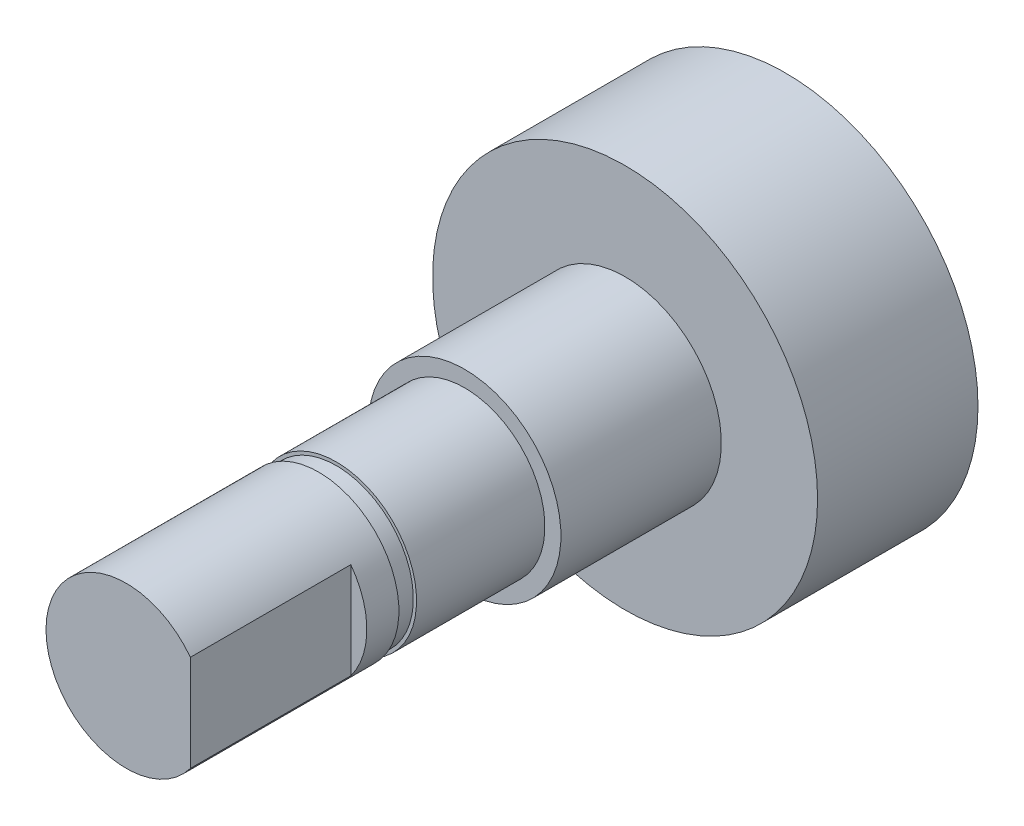
ISO-10303-21;
HEADER;
FILE_DESCRIPTION(('STEP AP214'),'2;1');
FILE_NAME('part.step','',(''),(''),'','','');
FILE_SCHEMA(('AUTOMOTIVE_DESIGN { 1 0 10303 214 1 1 1 1 }'));
ENDSEC;
DATA;
#1=APPLICATION_CONTEXT('core data for automotive mechanical design processes');
#2=APPLICATION_PROTOCOL_DEFINITION('international standard','automotive_design',2000,#1);
#3=PRODUCT_CONTEXT('',#1,'mechanical');
#4=PRODUCT('Part','Part','',(#3));
#5=PRODUCT_RELATED_PRODUCT_CATEGORY('part','',(#4));
#6=PRODUCT_DEFINITION_FORMATION('','',#4);
#7=PRODUCT_DEFINITION_CONTEXT('part definition',#1,'design');
#8=PRODUCT_DEFINITION('design','',#6,#7);
#9=PRODUCT_DEFINITION_SHAPE('','',#8);
#10=(LENGTH_UNIT() NAMED_UNIT(*) SI_UNIT(.MILLI.,.METRE.));
#11=(NAMED_UNIT(*) PLANE_ANGLE_UNIT() SI_UNIT($,.RADIAN.));
#12=(NAMED_UNIT(*) SI_UNIT($,.STERADIAN.) SOLID_ANGLE_UNIT());
#13=UNCERTAINTY_MEASURE_WITH_UNIT(LENGTH_MEASURE(1.E-05),#10,'distance_accuracy_value','');
#14=(GEOMETRIC_REPRESENTATION_CONTEXT(3) GLOBAL_UNCERTAINTY_ASSIGNED_CONTEXT((#13)) GLOBAL_UNIT_ASSIGNED_CONTEXT((#10,
#11,#12)) REPRESENTATION_CONTEXT('',''));
#15=CARTESIAN_POINT('',(0.,0.,0.));
#16=DIRECTION('',(0.,0.,1.));
#17=DIRECTION('',(1.,0.,0.));
#18=AXIS2_PLACEMENT_3D('',#15,#16,#17);
#19=CARTESIAN_POINT('',(0.,0.,21.1));
#20=DIRECTION('',(0.,0.,1.));
#21=DIRECTION('',(1.,0.,0.));
#22=AXIS2_PLACEMENT_3D('',#19,#20,#21);
#23=PLANE('',#22);
#24=CARTESIAN_POINT('',(0.,0.,21.1));
#25=DIRECTION('',(0.,0.,-1.));
#26=DIRECTION('',(-1.,0.,0.));
#27=AXIS2_PLACEMENT_3D('',#24,#25,#26);
#28=CIRCLE('',#27,5.);
#29=CARTESIAN_POINT('',(4.,3.,21.1));
#30=VERTEX_POINT('',#29);
#31=CARTESIAN_POINT('',(4.,-3.,21.1));
#32=VERTEX_POINT('',#31);
#33=EDGE_CURVE('E20',#30,#32,#28,.T.);
#34=ORIENTED_EDGE('',*,*,#33,.F.);
#35=DIRECTION('',(0.,1.,0.));
#36=VECTOR('',#35,1.);
#37=CARTESIAN_POINT('',(4.,0.,21.1));
#38=LINE('',#37,#36);
#39=EDGE_CURVE('E58',#30,#32,#38,.F.);
#40=ORIENTED_EDGE('',*,*,#39,.T.);
#41=EDGE_LOOP('',(#34,#40));
#42=FACE_BOUND('',#41,.T.);
#43=ADVANCED_FACE('F17',(#42),#23,.T.);
#44=CARTESIAN_POINT('',(4.,0.,21.1));
#45=DIRECTION('',(-1.,0.,0.));
#46=DIRECTION('',(0.,0.,1.));
#47=AXIS2_PLACEMENT_3D('',#44,#45,#46);
#48=PLANE('',#47);
#49=DIRECTION('',(0.,0.,-1.));
#50=VECTOR('',#49,1.);
#51=CARTESIAN_POINT('',(4.,-3.,31.1));
#52=LINE('',#51,#50);
#53=CARTESIAN_POINT('',(4.,-3.,31.1));
#54=VERTEX_POINT('',#53);
#55=EDGE_CURVE('E60',#32,#54,#52,.F.);
#56=ORIENTED_EDGE('',*,*,#55,.F.);
#57=ORIENTED_EDGE('',*,*,#39,.F.);
#58=DIRECTION('',(0.,0.,-1.));
#59=VECTOR('',#58,1.);
#60=CARTESIAN_POINT('',(4.,3.,31.1));
#61=LINE('',#60,#59);
#62=CARTESIAN_POINT('',(4.,3.,31.1));
#63=VERTEX_POINT('',#62);
#64=EDGE_CURVE('E61',#63,#30,#61,.T.);
#65=ORIENTED_EDGE('',*,*,#64,.F.);
#66=DIRECTION('',(0.,1.,0.));
#67=VECTOR('',#66,1.);
#68=CARTESIAN_POINT('',(4.,0.,31.1));
#69=LINE('',#68,#67);
#70=EDGE_CURVE('E65',#54,#63,#69,.T.);
#71=ORIENTED_EDGE('',*,*,#70,.F.);
#72=EDGE_LOOP('',(#56,#57,#65,#71));
#73=FACE_BOUND('',#72,.T.);
#74=ADVANCED_FACE('F64',(#73),#48,.F.);
#75=CARTESIAN_POINT('',(0.,0.,31.1));
#76=DIRECTION('',(0.,0.,1.));
#77=DIRECTION('',(1.,0.,0.));
#78=AXIS2_PLACEMENT_3D('',#75,#76,#77);
#79=PLANE('',#78);
#80=ORIENTED_EDGE('',*,*,#70,.T.);
#81=CARTESIAN_POINT('',(0.,0.,31.1));
#82=DIRECTION('',(0.,0.,-1.));
#83=DIRECTION('',(-1.,0.,0.));
#84=AXIS2_PLACEMENT_3D('',#81,#82,#83);
#85=CIRCLE('',#84,5.);
#86=EDGE_CURVE('E52',#54,#63,#85,.T.);
#87=ORIENTED_EDGE('',*,*,#86,.F.);
#88=EDGE_LOOP('',(#80,#87));
#89=FACE_BOUND('',#88,.T.);
#90=ADVANCED_FACE('F209',(#89),#79,.T.);
#91=CARTESIAN_POINT('',(0.,0.,31.1));
#92=DIRECTION('',(0.,0.,-1.));
#93=DIRECTION('',(-1.,0.,0.));
#94=AXIS2_PLACEMENT_3D('',#91,#92,#93);
#95=CYLINDRICAL_SURFACE('',#94,5.);
#96=ORIENTED_EDGE('',*,*,#64,.T.);
#97=ORIENTED_EDGE('',*,*,#33,.T.);
#98=ORIENTED_EDGE('',*,*,#55,.T.);
#99=ORIENTED_EDGE('',*,*,#86,.T.);
#100=EDGE_LOOP('',(#96,#97,#98,#99));
#101=FACE_BOUND('',#100,.T.);
#102=CARTESIAN_POINT('',(0.,0.,19.1));
#103=DIRECTION('',(0.,0.,-1.));
#104=DIRECTION('',(-1.,0.,0.));
#105=AXIS2_PLACEMENT_3D('',#102,#103,#104);
#106=CIRCLE('',#105,5.);
#107=CARTESIAN_POINT('',(-5.,0.,19.1));
#108=VERTEX_POINT('',#107);
#109=EDGE_CURVE('E113',#108,#108,#106,.F.);
#110=ORIENTED_EDGE('',*,*,#109,.T.);
#111=EDGE_LOOP('',(#110));
#112=FACE_BOUND('',#111,.T.);
#113=ADVANCED_FACE('F67',(#101,#112),#95,.T.);
#114=CARTESIAN_POINT('',(0.,0.,19.1));
#115=DIRECTION('',(0.,0.,1.));
#116=DIRECTION('',(1.,0.,0.));
#117=AXIS2_PLACEMENT_3D('',#114,#115,#116);
#118=PLANE('',#117);
#119=ORIENTED_EDGE('',*,*,#109,.F.);
#120=EDGE_LOOP('',(#119));
#121=FACE_BOUND('',#120,.T.);
#122=CARTESIAN_POINT('',(0.,0.,19.1));
#123=DIRECTION('',(0.,0.,-1.));
#124=DIRECTION('',(-1.,0.,0.));
#125=AXIS2_PLACEMENT_3D('',#122,#123,#124);
#126=CIRCLE('',#125,4.8);
#127=CARTESIAN_POINT('',(-4.8,0.,19.1));
#128=VERTEX_POINT('',#127);
#129=EDGE_CURVE('E110',#128,#128,#126,.T.);
#130=ORIENTED_EDGE('',*,*,#129,.F.);
#131=EDGE_LOOP('',(#130));
#132=FACE_BOUND('',#131,.T.);
#133=ADVANCED_FACE('F202',(#121,#132),#118,.F.);
#134=CARTESIAN_POINT('',(0.,0.,19.1));
#135=DIRECTION('',(0.,0.,-1.));
#136=DIRECTION('',(-1.,0.,0.));
#137=AXIS2_PLACEMENT_3D('',#134,#135,#136);
#138=CYLINDRICAL_SURFACE('',#137,4.8);
#139=CARTESIAN_POINT('',(0.,0.,18.));
#140=DIRECTION('',(0.,0.,-1.));
#141=DIRECTION('',(-1.,0.,0.));
#142=AXIS2_PLACEMENT_3D('',#139,#140,#141);
#143=CIRCLE('',#142,4.8);
#144=CARTESIAN_POINT('',(-4.8,0.,18.));
#145=VERTEX_POINT('',#144);
#146=EDGE_CURVE('E107',#145,#145,#143,.T.);
#147=ORIENTED_EDGE('',*,*,#146,.F.);
#148=EDGE_LOOP('',(#147));
#149=FACE_BOUND('',#148,.T.);
#150=ORIENTED_EDGE('',*,*,#129,.T.);
#151=EDGE_LOOP('',(#150));
#152=FACE_BOUND('',#151,.T.);
#153=ADVANCED_FACE('F198',(#149,#152),#138,.T.);
#154=CARTESIAN_POINT('',(0.,0.,18.));
#155=DIRECTION('',(0.,0.,1.));
#156=DIRECTION('',(1.,0.,0.));
#157=AXIS2_PLACEMENT_3D('',#154,#155,#156);
#158=PLANE('',#157);
#159=CARTESIAN_POINT('',(0.,0.,18.));
#160=DIRECTION('',(0.,0.,-1.));
#161=DIRECTION('',(-1.,0.,0.));
#162=AXIS2_PLACEMENT_3D('',#159,#160,#161);
#163=CIRCLE('',#162,5.);
#164=CARTESIAN_POINT('',(-5.,0.,18.));
#165=VERTEX_POINT('',#164);
#166=EDGE_CURVE('E104',#165,#165,#163,.T.);
#167=ORIENTED_EDGE('',*,*,#166,.F.);
#168=EDGE_LOOP('',(#167));
#169=FACE_BOUND('',#168,.T.);
#170=ORIENTED_EDGE('',*,*,#146,.T.);
#171=EDGE_LOOP('',(#170));
#172=FACE_BOUND('',#171,.T.);
#173=ADVANCED_FACE('F194',(#169,#172),#158,.T.);
#174=CARTESIAN_POINT('',(0.,0.,18.));
#175=DIRECTION('',(0.,0.,-1.));
#176=DIRECTION('',(-1.,0.,0.));
#177=AXIS2_PLACEMENT_3D('',#174,#175,#176);
#178=CYLINDRICAL_SURFACE('',#177,5.);
#179=CARTESIAN_POINT('',(0.,0.,10.));
#180=DIRECTION('',(0.,0.,-1.));
#181=DIRECTION('',(-1.,0.,0.));
#182=AXIS2_PLACEMENT_3D('',#179,#180,#181);
#183=CIRCLE('',#182,5.);
#184=CARTESIAN_POINT('',(-5.,0.,10.));
#185=VERTEX_POINT('',#184);
#186=EDGE_CURVE('E101',#185,#185,#183,.T.);
#187=ORIENTED_EDGE('',*,*,#186,.F.);
#188=EDGE_LOOP('',(#187));
#189=FACE_BOUND('',#188,.T.);
#190=ORIENTED_EDGE('',*,*,#166,.T.);
#191=EDGE_LOOP('',(#190));
#192=FACE_BOUND('',#191,.T.);
#193=ADVANCED_FACE('F190',(#189,#192),#178,.T.);
#194=CARTESIAN_POINT('',(0.,0.,10.));
#195=DIRECTION('',(0.,0.,1.));
#196=DIRECTION('',(1.,0.,0.));
#197=AXIS2_PLACEMENT_3D('',#194,#195,#196);
#198=PLANE('',#197);
#199=CARTESIAN_POINT('',(0.,0.,10.));
#200=DIRECTION('',(0.,0.,-1.));
#201=DIRECTION('',(-1.,0.,0.));
#202=AXIS2_PLACEMENT_3D('',#199,#200,#201);
#203=CIRCLE('',#202,6.);
#204=CARTESIAN_POINT('',(-6.,0.,10.));
#205=VERTEX_POINT('',#204);
#206=EDGE_CURVE('E98',#205,#205,#203,.T.);
#207=ORIENTED_EDGE('',*,*,#206,.F.);
#208=EDGE_LOOP('',(#207));
#209=FACE_BOUND('',#208,.T.);
#210=ORIENTED_EDGE('',*,*,#186,.T.);
#211=EDGE_LOOP('',(#210));
#212=FACE_BOUND('',#211,.T.);
#213=ADVANCED_FACE('F183',(#209,#212),#198,.T.);
#214=CARTESIAN_POINT('',(0.,0.,10.));
#215=DIRECTION('',(0.,0.,-1.));
#216=DIRECTION('',(-1.,0.,0.));
#217=AXIS2_PLACEMENT_3D('',#214,#215,#216);
#218=CYLINDRICAL_SURFACE('',#217,6.);
#219=CARTESIAN_POINT('',(0.,0.,0.));
#220=DIRECTION('',(0.,0.,-1.));
#221=DIRECTION('',(-1.,0.,0.));
#222=AXIS2_PLACEMENT_3D('',#219,#220,#221);
#223=CIRCLE('',#222,6.);
#224=CARTESIAN_POINT('',(-6.,0.,0.));
#225=VERTEX_POINT('',#224);
#226=EDGE_CURVE('E95',#225,#225,#223,.F.);
#227=ORIENTED_EDGE('',*,*,#226,.T.);
#228=EDGE_LOOP('',(#227));
#229=FACE_BOUND('',#228,.T.);
#230=ORIENTED_EDGE('',*,*,#206,.T.);
#231=EDGE_LOOP('',(#230));
#232=FACE_BOUND('',#231,.T.);
#233=ADVANCED_FACE('F174',(#229,#232),#218,.T.);
#234=CARTESIAN_POINT('',(0.,0.,-3.));
#235=DIRECTION('',(0.,0.,-1.));
#236=DIRECTION('',(-1.,0.,0.));
#237=AXIS2_PLACEMENT_3D('',#234,#235,#236);
#238=PLANE('',#237);
#239=CARTESIAN_POINT('',(0.,0.,-3.));
#240=DIRECTION('',(0.,0.,-1.));
#241=DIRECTION('',(-1.,0.,0.));
#242=AXIS2_PLACEMENT_3D('',#239,#240,#241);
#243=CIRCLE('',#242,4.);
#244=CARTESIAN_POINT('',(-4.,0.,-3.));
#245=VERTEX_POINT('',#244);
#246=EDGE_CURVE('E91',#245,#245,#243,.T.);
#247=ORIENTED_EDGE('',*,*,#246,.T.);
#248=EDGE_LOOP('',(#247));
#249=FACE_BOUND('',#248,.T.);
#250=ADVANCED_FACE('F171',(#249),#238,.T.);
#251=CARTESIAN_POINT('',(-7.5,0.,-1.50000000002137));
#252=DIRECTION('',(0.,0.,-1.));
#253=DIRECTION('',(0.,1.,0.));
#254=AXIS2_PLACEMENT_3D('',#251,#252,#253);
#255=CONICAL_SURFACE('',#254,1.24999999996362,1.0297442586752);
#256=CARTESIAN_POINT('',(-7.49999999993634,0.,-0.748924226257941));
#257=VERTEX_POINT('',#256);
#258=VERTEX_LOOP('',#257);
#259=FACE_BOUND('',#258,.T.);
#260=CARTESIAN_POINT('',(-7.5,0.,-1.49999999999999));
#261=DIRECTION('',(0.,0.,-1.));
#262=DIRECTION('',(-1.,0.,0.));
#263=AXIS2_PLACEMENT_3D('',#260,#261,#262);
#264=CIRCLE('',#263,1.24999999999999);
#265=CARTESIAN_POINT('',(-8.74999999999999,0.,-1.49999999999999));
#266=VERTEX_POINT('',#265);
#267=EDGE_CURVE('E94',#266,#266,#264,.T.);
#268=ORIENTED_EDGE('',*,*,#267,.T.);
#269=EDGE_LOOP('',(#268));
#270=FACE_BOUND('',#269,.T.);
#271=ADVANCED_FACE('F173',(#259,#270),#255,.F.);
#272=CARTESIAN_POINT('',(0.,-7.5,-1.49999999985084));
#273=DIRECTION('',(0.,0.,-1.));
#274=DIRECTION('',(0.,1.,0.));
#275=AXIS2_PLACEMENT_3D('',#272,#273,#274);
#276=CONICAL_SURFACE('',#275,1.24999999979994,1.0297442583943);
#277=CARTESIAN_POINT('',(-1.13660651611575E-10,-7.5,-0.748924226115832));
#278=VERTEX_POINT('',#277);
#279=VERTEX_LOOP('',#278);
#280=FACE_BOUND('',#279,.T.);
#281=CARTESIAN_POINT('',(0.,-7.5,-1.49999999999999));
#282=DIRECTION('',(0.,0.,-1.));
#283=DIRECTION('',(-1.,0.,0.));
#284=AXIS2_PLACEMENT_3D('',#281,#282,#283);
#285=CIRCLE('',#284,1.24999999999999);
#286=CARTESIAN_POINT('',(-1.24999999999996,-7.5,-1.49999999999999));
#287=VERTEX_POINT('',#286);
#288=EDGE_CURVE('E118',#287,#287,#285,.T.);
#289=ORIENTED_EDGE('',*,*,#288,.T.);
#290=EDGE_LOOP('',(#289));
#291=FACE_BOUND('',#290,.T.);
#292=ADVANCED_FACE('F180',(#280,#291),#276,.F.);
#293=CARTESIAN_POINT('',(7.5,0.,-1.50000000002137));
#294=DIRECTION('',(0.,0.,-1.));
#295=DIRECTION('',(0.,1.,0.));
#296=AXIS2_PLACEMENT_3D('',#293,#294,#295);
#297=CONICAL_SURFACE('',#296,1.25000000003411,1.02974425868194);
#298=CARTESIAN_POINT('',(7.49999999999318,0.,-0.748924226229519));
#299=VERTEX_POINT('',#298);
#300=VERTEX_LOOP('',#299);
#301=FACE_BOUND('',#300,.T.);
#302=CARTESIAN_POINT('',(7.5,0.,-1.49999999999999));
#303=DIRECTION('',(0.,0.,-1.));
#304=DIRECTION('',(-1.,0.,0.));
#305=AXIS2_PLACEMENT_3D('',#302,#303,#304);
#306=CIRCLE('',#305,1.24999999999999);
#307=CARTESIAN_POINT('',(6.25000000000001,0.,-1.49999999999999));
#308=VERTEX_POINT('',#307);
#309=EDGE_CURVE('E121',#308,#308,#306,.T.);
#310=ORIENTED_EDGE('',*,*,#309,.T.);
#311=EDGE_LOOP('',(#310));
#312=FACE_BOUND('',#311,.T.);
#313=ADVANCED_FACE('F294',(#301,#312),#297,.F.);
#314=CARTESIAN_POINT('',(0.,7.5,-1.49999999985084));
#315=DIRECTION('',(0.,0.,-1.));
#316=DIRECTION('',(0.,1.,0.));
#317=AXIS2_PLACEMENT_3D('',#314,#315,#316);
#318=CONICAL_SURFACE('',#317,1.24999999979983,1.02974425839423);
#319=CARTESIAN_POINT('',(-1.1376539605174E-10,7.5,-0.748924226115832));
#320=VERTEX_POINT('',#319);
#321=VERTEX_LOOP('',#320);
#322=FACE_BOUND('',#321,.T.);
#323=CARTESIAN_POINT('',(0.,7.5,-1.49999999999999));
#324=DIRECTION('',(0.,0.,-1.));
#325=DIRECTION('',(-1.,0.,0.));
#326=AXIS2_PLACEMENT_3D('',#323,#324,#325);
#327=CIRCLE('',#326,1.24999999999999);
#328=CARTESIAN_POINT('',(-1.25000000000007,7.5,-1.49999999999999));
#329=VERTEX_POINT('',#328);
#330=EDGE_CURVE('E90',#329,#329,#327,.T.);
#331=ORIENTED_EDGE('',*,*,#330,.T.);
#332=EDGE_LOOP('',(#331));
#333=FACE_BOUND('',#332,.T.);
#334=ADVANCED_FACE('F127',(#322,#333),#318,.F.);
#335=CARTESIAN_POINT('',(0.,0.,0.));
#336=DIRECTION('',(0.,0.,-1.));
#337=DIRECTION('',(-1.,0.,0.));
#338=AXIS2_PLACEMENT_3D('',#335,#336,#337);
#339=PLANE('',#338);
#340=CARTESIAN_POINT('',(0.,0.,0.));
#341=DIRECTION('',(0.,0.,1.));
#342=DIRECTION('',(1.,0.,0.));
#343=AXIS2_PLACEMENT_3D('',#340,#341,#342);
#344=CIRCLE('',#343,12.);
#345=CARTESIAN_POINT('',(12.,0.,0.));
#346=VERTEX_POINT('',#345);
#347=EDGE_CURVE('E87',#346,#346,#344,.F.);
#348=ORIENTED_EDGE('',*,*,#347,.F.);
#349=EDGE_LOOP('',(#348));
#350=FACE_BOUND('',#349,.T.);
#351=ORIENTED_EDGE('',*,*,#226,.F.);
#352=EDGE_LOOP('',(#351));
#353=FACE_BOUND('',#352,.T.);
#354=ADVANCED_FACE('F167',(#350,#353),#339,.F.);
#355=CARTESIAN_POINT('',(0.,0.,-3.));
#356=DIRECTION('',(0.,0.,-1.));
#357=DIRECTION('',(-1.,0.,0.));
#358=AXIS2_PLACEMENT_3D('',#355,#356,#357);
#359=CYLINDRICAL_SURFACE('',#358,4.);
#360=CARTESIAN_POINT('',(0.,0.,-10.));
#361=DIRECTION('',(0.,0.,-1.));
#362=DIRECTION('',(-1.,0.,0.));
#363=AXIS2_PLACEMENT_3D('',#360,#361,#362);
#364=CIRCLE('',#363,4.);
#365=CARTESIAN_POINT('',(-4.,0.,-10.));
#366=VERTEX_POINT('',#365);
#367=EDGE_CURVE('E84',#366,#366,#364,.F.);
#368=ORIENTED_EDGE('',*,*,#367,.F.);
#369=EDGE_LOOP('',(#368));
#370=FACE_BOUND('',#369,.T.);
#371=ORIENTED_EDGE('',*,*,#246,.F.);
#372=EDGE_LOOP('',(#371));
#373=FACE_BOUND('',#372,.T.);
#374=ADVANCED_FACE('F163',(#370,#373),#359,.F.);
#375=CARTESIAN_POINT('',(-7.5,0.,-10.));
#376=DIRECTION('',(0.,0.,-1.));
#377=DIRECTION('',(-1.,0.,0.));
#378=AXIS2_PLACEMENT_3D('',#375,#376,#377);
#379=CYLINDRICAL_SURFACE('',#378,1.24999999999999);
#380=CARTESIAN_POINT('',(-7.5,0.,-10.));
#381=DIRECTION('',(0.,0.,-1.));
#382=DIRECTION('',(-1.,0.,0.));
#383=AXIS2_PLACEMENT_3D('',#380,#381,#382);
#384=CIRCLE('',#383,1.24999999999999);
#385=CARTESIAN_POINT('',(-8.74999999999999,0.,-10.));
#386=VERTEX_POINT('',#385);
#387=EDGE_CURVE('E81',#386,#386,#384,.F.);
#388=ORIENTED_EDGE('',*,*,#387,.F.);
#389=EDGE_LOOP('',(#388));
#390=FACE_BOUND('',#389,.T.);
#391=ORIENTED_EDGE('',*,*,#267,.F.);
#392=EDGE_LOOP('',(#391));
#393=FACE_BOUND('',#392,.T.);
#394=ADVANCED_FACE('F166',(#390,#393),#379,.F.);
#395=CARTESIAN_POINT('',(0.,-7.5,-10.));
#396=DIRECTION('',(0.,0.,-1.));
#397=DIRECTION('',(-1.,0.,0.));
#398=AXIS2_PLACEMENT_3D('',#395,#396,#397);
#399=CYLINDRICAL_SURFACE('',#398,1.24999999999999);
#400=CARTESIAN_POINT('',(0.,-7.5,-10.));
#401=DIRECTION('',(0.,0.,-1.));
#402=DIRECTION('',(-1.,0.,0.));
#403=AXIS2_PLACEMENT_3D('',#400,#401,#402);
#404=CIRCLE('',#403,1.24999999999999);
#405=CARTESIAN_POINT('',(-1.24999999999996,-7.5,-10.));
#406=VERTEX_POINT('',#405);
#407=EDGE_CURVE('E78',#406,#406,#404,.F.);
#408=ORIENTED_EDGE('',*,*,#407,.F.);
#409=EDGE_LOOP('',(#408));
#410=FACE_BOUND('',#409,.T.);
#411=ORIENTED_EDGE('',*,*,#288,.F.);
#412=EDGE_LOOP('',(#411));
#413=FACE_BOUND('',#412,.T.);
#414=ADVANCED_FACE('F143',(#410,#413),#399,.F.);
#415=CARTESIAN_POINT('',(7.5,0.,-10.));
#416=DIRECTION('',(0.,0.,-1.));
#417=DIRECTION('',(-1.,0.,0.));
#418=AXIS2_PLACEMENT_3D('',#415,#416,#417);
#419=CYLINDRICAL_SURFACE('',#418,1.24999999999999);
#420=CARTESIAN_POINT('',(7.5,0.,-10.));
#421=DIRECTION('',(0.,0.,-1.));
#422=DIRECTION('',(-1.,0.,0.));
#423=AXIS2_PLACEMENT_3D('',#420,#421,#422);
#424=CIRCLE('',#423,1.24999999999999);
#425=CARTESIAN_POINT('',(6.25000000000001,0.,-10.));
#426=VERTEX_POINT('',#425);
#427=EDGE_CURVE('E75',#426,#426,#424,.F.);
#428=ORIENTED_EDGE('',*,*,#427,.F.);
#429=EDGE_LOOP('',(#428));
#430=FACE_BOUND('',#429,.T.);
#431=ORIENTED_EDGE('',*,*,#309,.F.);
#432=EDGE_LOOP('',(#431));
#433=FACE_BOUND('',#432,.T.);
#434=ADVANCED_FACE('F132',(#430,#433),#419,.F.);
#435=CARTESIAN_POINT('',(0.,7.5,-10.));
#436=DIRECTION('',(0.,0.,-1.));
#437=DIRECTION('',(-1.,0.,0.));
#438=AXIS2_PLACEMENT_3D('',#435,#436,#437);
#439=CYLINDRICAL_SURFACE('',#438,1.24999999999999);
#440=CARTESIAN_POINT('',(0.,7.5,-10.));
#441=DIRECTION('',(0.,0.,-1.));
#442=DIRECTION('',(-1.,0.,0.));
#443=AXIS2_PLACEMENT_3D('',#440,#441,#442);
#444=CIRCLE('',#443,1.24999999999999);
#445=CARTESIAN_POINT('',(-1.25000000000007,7.5,-10.));
#446=VERTEX_POINT('',#445);
#447=EDGE_CURVE('E26',#446,#446,#444,.F.);
#448=ORIENTED_EDGE('',*,*,#447,.F.);
#449=EDGE_LOOP('',(#448));
#450=FACE_BOUND('',#449,.T.);
#451=ORIENTED_EDGE('',*,*,#330,.F.);
#452=EDGE_LOOP('',(#451));
#453=FACE_BOUND('',#452,.T.);
#454=ADVANCED_FACE('F129',(#450,#453),#439,.F.);
#455=CARTESIAN_POINT('',(0.,0.,-10.));
#456=DIRECTION('',(0.,0.,1.));
#457=DIRECTION('',(1.,0.,0.));
#458=AXIS2_PLACEMENT_3D('',#455,#456,#457);
#459=CYLINDRICAL_SURFACE('',#458,12.);
#460=ORIENTED_EDGE('',*,*,#347,.T.);
#461=EDGE_LOOP('',(#460));
#462=FACE_BOUND('',#461,.T.);
#463=CARTESIAN_POINT('',(0.,0.,-10.));
#464=DIRECTION('',(0.,0.,1.));
#465=DIRECTION('',(1.,0.,0.));
#466=AXIS2_PLACEMENT_3D('',#463,#464,#465);
#467=CIRCLE('',#466,12.);
#468=CARTESIAN_POINT('',(12.,0.,-10.));
#469=VERTEX_POINT('',#468);
#470=EDGE_CURVE('E11',#469,#469,#467,.F.);
#471=ORIENTED_EDGE('',*,*,#470,.F.);
#472=EDGE_LOOP('',(#471));
#473=FACE_BOUND('',#472,.T.);
#474=ADVANCED_FACE('F131',(#462,#473),#459,.T.);
#475=CARTESIAN_POINT('',(0.,0.,-10.));
#476=DIRECTION('',(0.,0.,-1.));
#477=DIRECTION('',(-1.,0.,0.));
#478=AXIS2_PLACEMENT_3D('',#475,#476,#477);
#479=PLANE('',#478);
#480=ORIENTED_EDGE('',*,*,#470,.T.);
#481=EDGE_LOOP('',(#480));
#482=FACE_BOUND('',#481,.T.);
#483=ORIENTED_EDGE('',*,*,#447,.T.);
#484=EDGE_LOOP('',(#483));
#485=FACE_BOUND('',#484,.T.);
#486=ORIENTED_EDGE('',*,*,#427,.T.);
#487=EDGE_LOOP('',(#486));
#488=FACE_BOUND('',#487,.T.);
#489=ORIENTED_EDGE('',*,*,#407,.T.);
#490=EDGE_LOOP('',(#489));
#491=FACE_BOUND('',#490,.T.);
#492=ORIENTED_EDGE('',*,*,#387,.T.);
#493=EDGE_LOOP('',(#492));
#494=FACE_BOUND('',#493,.T.);
#495=ORIENTED_EDGE('',*,*,#367,.T.);
#496=EDGE_LOOP('',(#495));
#497=FACE_BOUND('',#496,.T.);
#498=ADVANCED_FACE('F140',(#482,#485,#488,#491,#494,#497),#479,.T.);
#499=CLOSED_SHELL('',(#43,#74,#90,#113,#133,#153,#173,#193,#213,#233,#250,#271,#292,#313,#334,
#354,#374,#394,#414,#434,#454,#474,#498));
#500=MANIFOLD_SOLID_BREP('B1',#499);
#501=ADVANCED_BREP_SHAPE_REPRESENTATION('',(#18,#500),#14);
#502=SHAPE_DEFINITION_REPRESENTATION(#9,#501);
ENDSEC;
END-ISO-10303-21;
